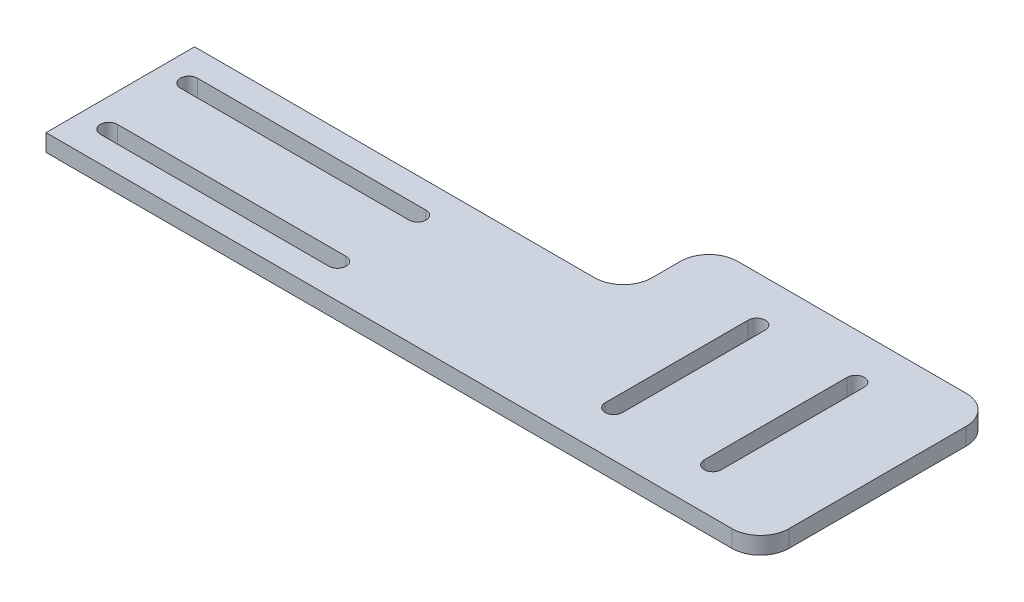
ISO-10303-21;
HEADER;
FILE_DESCRIPTION(('STEP AP214'),'2;1');
FILE_NAME('part.step','',(''),(''),'','','');
FILE_SCHEMA(('AUTOMOTIVE_DESIGN { 1 0 10303 214 1 1 1 1 }'));
ENDSEC;
DATA;
#1=APPLICATION_CONTEXT('core data for automotive mechanical design processes');
#2=APPLICATION_PROTOCOL_DEFINITION('international standard','automotive_design',2000,#1);
#3=PRODUCT_CONTEXT('',#1,'mechanical');
#4=PRODUCT('Part','Part','',(#3));
#5=PRODUCT_RELATED_PRODUCT_CATEGORY('part','',(#4));
#6=PRODUCT_DEFINITION_FORMATION('','',#4);
#7=PRODUCT_DEFINITION_CONTEXT('part definition',#1,'design');
#8=PRODUCT_DEFINITION('design','',#6,#7);
#9=PRODUCT_DEFINITION_SHAPE('','',#8);
#10=(LENGTH_UNIT() NAMED_UNIT(*) SI_UNIT(.MILLI.,.METRE.));
#11=(NAMED_UNIT(*) PLANE_ANGLE_UNIT() SI_UNIT($,.RADIAN.));
#12=(NAMED_UNIT(*) SI_UNIT($,.STERADIAN.) SOLID_ANGLE_UNIT());
#13=UNCERTAINTY_MEASURE_WITH_UNIT(LENGTH_MEASURE(1.E-05),#10,'distance_accuracy_value','');
#14=(GEOMETRIC_REPRESENTATION_CONTEXT(3) GLOBAL_UNCERTAINTY_ASSIGNED_CONTEXT((#13)) GLOBAL_UNIT_ASSIGNED_CONTEXT((#10,
#11,#12)) REPRESENTATION_CONTEXT('',''));
#15=CARTESIAN_POINT('',(0.,0.,0.));
#16=DIRECTION('',(0.,0.,1.));
#17=DIRECTION('',(1.,0.,0.));
#18=AXIS2_PLACEMENT_3D('',#15,#16,#17);
#19=CARTESIAN_POINT('',(0.,3.,26.));
#20=DIRECTION('',(1.,0.,0.));
#21=DIRECTION('',(0.,0.,-1.));
#22=AXIS2_PLACEMENT_3D('',#19,#20,#21);
#23=PLANE('',#22);
#24=DIRECTION('',(0.,0.,1.));
#25=VECTOR('',#24,1.);
#26=CARTESIAN_POINT('',(0.,0.,26.));
#27=LINE('',#26,#25);
#28=CARTESIAN_POINT('',(0.,0.,0.));
#29=VERTEX_POINT('',#28);
#30=CARTESIAN_POINT('',(0.,0.,26.));
#31=VERTEX_POINT('',#30);
#32=EDGE_CURVE('E305',#29,#31,#27,.T.);
#33=ORIENTED_EDGE('',*,*,#32,.T.);
#34=DIRECTION('',(0.,-1.,0.));
#35=VECTOR('',#34,1.);
#36=CARTESIAN_POINT('',(0.,3.,26.));
#37=LINE('',#36,#35);
#38=CARTESIAN_POINT('',(0.,3.,26.));
#39=VERTEX_POINT('',#38);
#40=EDGE_CURVE('E378',#39,#31,#37,.T.);
#41=ORIENTED_EDGE('',*,*,#40,.F.);
#42=DIRECTION('',(0.,0.,1.));
#43=VECTOR('',#42,1.);
#44=CARTESIAN_POINT('',(0.,3.,26.));
#45=LINE('',#44,#43);
#46=CARTESIAN_POINT('',(0.,3.,0.));
#47=VERTEX_POINT('',#46);
#48=EDGE_CURVE('E342',#47,#39,#45,.T.);
#49=ORIENTED_EDGE('',*,*,#48,.F.);
#50=DIRECTION('',(0.,-1.,0.));
#51=VECTOR('',#50,1.);
#52=CARTESIAN_POINT('',(0.,3.,0.));
#53=LINE('',#52,#51);
#54=EDGE_CURVE('E360',#47,#29,#53,.T.);
#55=ORIENTED_EDGE('',*,*,#54,.T.);
#56=EDGE_LOOP('',(#33,#41,#49,#55));
#57=FACE_BOUND('',#56,.T.);
#58=ADVANCED_FACE('F36',(#57),#23,.F.);
#59=CARTESIAN_POINT('',(125.,3.,26.));
#60=DIRECTION('',(0.,0.,-1.));
#61=DIRECTION('',(-1.,0.,0.));
#62=AXIS2_PLACEMENT_3D('',#59,#60,#61);
#63=PLANE('',#62);
#64=DIRECTION('',(1.,0.,0.));
#65=VECTOR('',#64,1.);
#66=CARTESIAN_POINT('',(125.,0.,26.));
#67=LINE('',#66,#65);
#68=CARTESIAN_POINT('',(120.,0.,26.));
#69=VERTEX_POINT('',#68);
#70=EDGE_CURVE('E363',#31,#69,#67,.T.);
#71=ORIENTED_EDGE('',*,*,#70,.T.);
#72=DIRECTION('',(0.,-1.,0.));
#73=VECTOR('',#72,1.);
#74=CARTESIAN_POINT('',(120.,3.,26.));
#75=LINE('',#74,#73);
#76=CARTESIAN_POINT('',(120.,3.,26.));
#77=VERTEX_POINT('',#76);
#78=EDGE_CURVE('E411',#69,#77,#75,.F.);
#79=ORIENTED_EDGE('',*,*,#78,.T.);
#80=DIRECTION('',(1.,0.,0.));
#81=VECTOR('',#80,1.);
#82=CARTESIAN_POINT('',(125.,3.,26.));
#83=LINE('',#82,#81);
#84=EDGE_CURVE('E345',#39,#77,#83,.T.);
#85=ORIENTED_EDGE('',*,*,#84,.F.);
#86=ORIENTED_EDGE('',*,*,#40,.T.);
#87=EDGE_LOOP('',(#71,#79,#85,#86));
#88=FACE_BOUND('',#87,.T.);
#89=ADVANCED_FACE('F465',(#88),#63,.F.);
#90=CARTESIAN_POINT('',(125.,3.,-15.));
#91=DIRECTION('',(-1.,0.,0.));
#92=DIRECTION('',(0.,0.,1.));
#93=AXIS2_PLACEMENT_3D('',#90,#91,#92);
#94=PLANE('',#93);
#95=DIRECTION('',(0.,0.,-1.));
#96=VECTOR('',#95,1.);
#97=CARTESIAN_POINT('',(125.,3.,-15.));
#98=LINE('',#97,#96);
#99=CARTESIAN_POINT('',(125.,3.,21.));
#100=VERTEX_POINT('',#99);
#101=CARTESIAN_POINT('',(125.,3.,-9.99999999999999));
#102=VERTEX_POINT('',#101);
#103=EDGE_CURVE('E349',#100,#102,#98,.T.);
#104=ORIENTED_EDGE('',*,*,#103,.F.);
#105=DIRECTION('',(0.,-1.,0.));
#106=VECTOR('',#105,1.);
#107=CARTESIAN_POINT('',(125.,3.,21.));
#108=LINE('',#107,#106);
#109=CARTESIAN_POINT('',(125.,0.,21.));
#110=VERTEX_POINT('',#109);
#111=EDGE_CURVE('E408',#100,#110,#108,.T.);
#112=ORIENTED_EDGE('',*,*,#111,.T.);
#113=DIRECTION('',(0.,0.,-1.));
#114=VECTOR('',#113,1.);
#115=CARTESIAN_POINT('',(125.,0.,-15.));
#116=LINE('',#115,#114);
#117=CARTESIAN_POINT('',(125.,0.,-9.99999999999999));
#118=VERTEX_POINT('',#117);
#119=EDGE_CURVE('E366',#110,#118,#116,.T.);
#120=ORIENTED_EDGE('',*,*,#119,.T.);
#121=DIRECTION('',(0.,-1.,0.));
#122=VECTOR('',#121,1.);
#123=CARTESIAN_POINT('',(125.,3.,-9.99999999999999));
#124=LINE('',#123,#122);
#125=EDGE_CURVE('E406',#118,#102,#124,.F.);
#126=ORIENTED_EDGE('',*,*,#125,.T.);
#127=EDGE_LOOP('',(#104,#112,#120,#126));
#128=FACE_BOUND('',#127,.T.);
#129=ADVANCED_FACE('F443',(#128),#94,.F.);
#130=CARTESIAN_POINT('',(75.,3.,-15.));
#131=DIRECTION('',(0.,0.,1.));
#132=DIRECTION('',(1.,0.,0.));
#133=AXIS2_PLACEMENT_3D('',#130,#131,#132);
#134=PLANE('',#133);
#135=DIRECTION('',(-1.,0.,0.));
#136=VECTOR('',#135,1.);
#137=CARTESIAN_POINT('',(75.,0.,-15.));
#138=LINE('',#137,#136);
#139=CARTESIAN_POINT('',(120.,0.,-15.));
#140=VERTEX_POINT('',#139);
#141=CARTESIAN_POINT('',(80.,0.,-15.));
#142=VERTEX_POINT('',#141);
#143=EDGE_CURVE('E369',#140,#142,#138,.T.);
#144=ORIENTED_EDGE('',*,*,#143,.T.);
#145=DIRECTION('',(0.,-1.,0.));
#146=VECTOR('',#145,1.);
#147=CARTESIAN_POINT('',(80.,3.,-15.));
#148=LINE('',#147,#146);
#149=CARTESIAN_POINT('',(80.,3.,-15.));
#150=VERTEX_POINT('',#149);
#151=EDGE_CURVE('E398',#142,#150,#148,.F.);
#152=ORIENTED_EDGE('',*,*,#151,.T.);
#153=DIRECTION('',(-1.,0.,0.));
#154=VECTOR('',#153,1.);
#155=CARTESIAN_POINT('',(75.,3.,-15.));
#156=LINE('',#155,#154);
#157=CARTESIAN_POINT('',(120.,3.,-15.));
#158=VERTEX_POINT('',#157);
#159=EDGE_CURVE('E352',#158,#150,#156,.T.);
#160=ORIENTED_EDGE('',*,*,#159,.F.);
#161=DIRECTION('',(0.,-1.,0.));
#162=VECTOR('',#161,1.);
#163=CARTESIAN_POINT('',(120.,3.,-15.));
#164=LINE('',#163,#162);
#165=EDGE_CURVE('E395',#158,#140,#164,.T.);
#166=ORIENTED_EDGE('',*,*,#165,.T.);
#167=EDGE_LOOP('',(#144,#152,#160,#166));
#168=FACE_BOUND('',#167,.T.);
#169=ADVANCED_FACE('F451',(#168),#134,.F.);
#170=CARTESIAN_POINT('',(75.,3.,0.));
#171=DIRECTION('',(1.,0.,0.));
#172=DIRECTION('',(0.,0.,-1.));
#173=AXIS2_PLACEMENT_3D('',#170,#171,#172);
#174=PLANE('',#173);
#175=DIRECTION('',(0.,0.,1.));
#176=VECTOR('',#175,1.);
#177=CARTESIAN_POINT('',(75.,0.,0.));
#178=LINE('',#177,#176);
#179=CARTESIAN_POINT('',(75.,0.,-9.99999999999999));
#180=VERTEX_POINT('',#179);
#181=CARTESIAN_POINT('',(75.,0.,-5.));
#182=VERTEX_POINT('',#181);
#183=EDGE_CURVE('E372',#180,#182,#178,.T.);
#184=ORIENTED_EDGE('',*,*,#183,.T.);
#185=DIRECTION('',(0.,-1.,0.));
#186=VECTOR('',#185,1.);
#187=CARTESIAN_POINT('',(75.,3.,-5.));
#188=LINE('',#187,#186);
#189=CARTESIAN_POINT('',(75.,3.,-5.));
#190=VERTEX_POINT('',#189);
#191=EDGE_CURVE('E387',#182,#190,#188,.F.);
#192=ORIENTED_EDGE('',*,*,#191,.T.);
#193=DIRECTION('',(0.,0.,1.));
#194=VECTOR('',#193,1.);
#195=CARTESIAN_POINT('',(75.,3.,0.));
#196=LINE('',#195,#194);
#197=CARTESIAN_POINT('',(75.,3.,-9.99999999999999));
#198=VERTEX_POINT('',#197);
#199=EDGE_CURVE('E355',#198,#190,#196,.T.);
#200=ORIENTED_EDGE('',*,*,#199,.F.);
#201=DIRECTION('',(0.,-1.,0.));
#202=VECTOR('',#201,1.);
#203=CARTESIAN_POINT('',(75.,3.,-9.99999999999999));
#204=LINE('',#203,#202);
#205=EDGE_CURVE('E384',#198,#180,#204,.T.);
#206=ORIENTED_EDGE('',*,*,#205,.T.);
#207=EDGE_LOOP('',(#184,#192,#200,#206));
#208=FACE_BOUND('',#207,.T.);
#209=ADVANCED_FACE('F420',(#208),#174,.F.);
#210=CARTESIAN_POINT('',(0.,3.,0.));
#211=DIRECTION('',(0.,0.,1.));
#212=DIRECTION('',(1.,0.,0.));
#213=AXIS2_PLACEMENT_3D('',#210,#211,#212);
#214=PLANE('',#213);
#215=DIRECTION('',(-1.,0.,0.));
#216=VECTOR('',#215,1.);
#217=CARTESIAN_POINT('',(0.,3.,0.));
#218=LINE('',#217,#216);
#219=CARTESIAN_POINT('',(70.,3.,0.));
#220=VERTEX_POINT('',#219);
#221=EDGE_CURVE('E358',#220,#47,#218,.T.);
#222=ORIENTED_EDGE('',*,*,#221,.F.);
#223=DIRECTION('',(0.,-1.,0.));
#224=VECTOR('',#223,1.);
#225=CARTESIAN_POINT('',(70.,0.,0.));
#226=LINE('',#225,#224);
#227=CARTESIAN_POINT('',(70.,0.,0.));
#228=VERTEX_POINT('',#227);
#229=EDGE_CURVE('E381',#220,#228,#226,.T.);
#230=ORIENTED_EDGE('',*,*,#229,.T.);
#231=DIRECTION('',(-1.,0.,0.));
#232=VECTOR('',#231,1.);
#233=CARTESIAN_POINT('',(0.,0.,0.));
#234=LINE('',#233,#232);
#235=EDGE_CURVE('E346',#228,#29,#234,.T.);
#236=ORIENTED_EDGE('',*,*,#235,.T.);
#237=ORIENTED_EDGE('',*,*,#54,.F.);
#238=EDGE_LOOP('',(#222,#230,#236,#237));
#239=FACE_BOUND('',#238,.T.);
#240=ADVANCED_FACE('F430',(#239),#214,.F.);
#241=CARTESIAN_POINT('',(0.,3.,0.));
#242=DIRECTION('',(0.,-1.,0.));
#243=DIRECTION('',(0.,0.,-1.));
#244=AXIS2_PLACEMENT_3D('',#241,#242,#243);
#245=PLANE('',#244);
#246=DIRECTION('',(-1.,0.,0.));
#247=VECTOR('',#246,1.);
#248=CARTESIAN_POINT('',(45.,3.,18.5));
#249=LINE('',#248,#247);
#250=CARTESIAN_POINT('',(45.,3.,18.5));
#251=VERTEX_POINT('',#250);
#252=CARTESIAN_POINT('',(5.,3.,18.5));
#253=VERTEX_POINT('',#252);
#254=EDGE_CURVE('E238',#251,#253,#249,.T.);
#255=ORIENTED_EDGE('',*,*,#254,.F.);
#256=CARTESIAN_POINT('',(45.,3.,20.));
#257=DIRECTION('',(0.,1.,0.));
#258=DIRECTION('',(0.,0.,1.));
#259=AXIS2_PLACEMENT_3D('',#256,#257,#258);
#260=CIRCLE('',#259,1.5);
#261=CARTESIAN_POINT('',(45.,3.,21.5));
#262=VERTEX_POINT('',#261);
#263=EDGE_CURVE('E51',#262,#251,#260,.T.);
#264=ORIENTED_EDGE('',*,*,#263,.F.);
#265=DIRECTION('',(1.,0.,0.));
#266=VECTOR('',#265,1.);
#267=CARTESIAN_POINT('',(45.,3.,21.5));
#268=LINE('',#267,#266);
#269=CARTESIAN_POINT('',(5.,3.,21.5));
#270=VERTEX_POINT('',#269);
#271=EDGE_CURVE('E229',#270,#262,#268,.T.);
#272=ORIENTED_EDGE('',*,*,#271,.F.);
#273=CARTESIAN_POINT('',(5.,3.,20.));
#274=DIRECTION('',(0.,1.,0.));
#275=DIRECTION('',(0.,0.,1.));
#276=AXIS2_PLACEMENT_3D('',#273,#274,#275);
#277=CIRCLE('',#276,1.5);
#278=EDGE_CURVE('E232',#253,#270,#277,.T.);
#279=ORIENTED_EDGE('',*,*,#278,.F.);
#280=EDGE_LOOP('',(#255,#264,#272,#279));
#281=FACE_BOUND('',#280,.T.);
#282=DIRECTION('',(-1.,0.,0.));
#283=VECTOR('',#282,1.);
#284=CARTESIAN_POINT('',(45.,3.,4.50000000000002));
#285=LINE('',#284,#283);
#286=CARTESIAN_POINT('',(45.,3.,4.50000000000002));
#287=VERTEX_POINT('',#286);
#288=CARTESIAN_POINT('',(5.,3.,4.50000000000003));
#289=VERTEX_POINT('',#288);
#290=EDGE_CURVE('E264',#287,#289,#285,.T.);
#291=ORIENTED_EDGE('',*,*,#290,.F.);
#292=CARTESIAN_POINT('',(45.,3.,6.00000000000003));
#293=DIRECTION('',(0.,1.,0.));
#294=DIRECTION('',(0.,0.,-1.));
#295=AXIS2_PLACEMENT_3D('',#292,#293,#294);
#296=CIRCLE('',#295,1.49999999999999);
#297=CARTESIAN_POINT('',(45.,3.,7.49999999999999));
#298=VERTEX_POINT('',#297);
#299=EDGE_CURVE('E59',#298,#287,#296,.T.);
#300=ORIENTED_EDGE('',*,*,#299,.F.);
#301=DIRECTION('',(1.,0.,0.));
#302=VECTOR('',#301,1.);
#303=CARTESIAN_POINT('',(45.,3.,7.49999999999999));
#304=LINE('',#303,#302);
#305=CARTESIAN_POINT('',(5.,3.,7.50000000000002));
#306=VERTEX_POINT('',#305);
#307=EDGE_CURVE('E253',#306,#298,#304,.T.);
#308=ORIENTED_EDGE('',*,*,#307,.F.);
#309=CARTESIAN_POINT('',(5.,3.,6.00000000000003));
#310=DIRECTION('',(0.,1.,0.));
#311=DIRECTION('',(0.,0.,-1.));
#312=AXIS2_PLACEMENT_3D('',#309,#310,#311);
#313=CIRCLE('',#312,1.49999999999999);
#314=EDGE_CURVE('E267',#289,#306,#313,.T.);
#315=ORIENTED_EDGE('',*,*,#314,.F.);
#316=EDGE_LOOP('',(#291,#300,#308,#315));
#317=FACE_BOUND('',#316,.T.);
#318=DIRECTION('',(0.,0.,1.));
#319=VECTOR('',#318,1.);
#320=CARTESIAN_POINT('',(89.84,3.,-6.99999999999996));
#321=LINE('',#320,#319);
#322=CARTESIAN_POINT('',(89.84,3.,-6.99999999999996));
#323=VERTEX_POINT('',#322);
#324=CARTESIAN_POINT('',(89.84,3.,18.));
#325=VERTEX_POINT('',#324);
#326=EDGE_CURVE('E294',#323,#325,#321,.T.);
#327=ORIENTED_EDGE('',*,*,#326,.F.);
#328=CARTESIAN_POINT('',(91.34,3.,-6.99999999999996));
#329=DIRECTION('',(0.,1.,0.));
#330=DIRECTION('',(0.,0.,1.));
#331=AXIS2_PLACEMENT_3D('',#328,#329,#330);
#332=CIRCLE('',#331,1.50000000000001);
#333=CARTESIAN_POINT('',(92.84,3.,-6.99999999999996));
#334=VERTEX_POINT('',#333);
#335=EDGE_CURVE('E292',#334,#323,#332,.T.);
#336=ORIENTED_EDGE('',*,*,#335,.F.);
#337=DIRECTION('',(0.,0.,-1.));
#338=VECTOR('',#337,1.);
#339=CARTESIAN_POINT('',(92.84,3.,-6.99999999999996));
#340=LINE('',#339,#338);
#341=CARTESIAN_POINT('',(92.84,3.,18.));
#342=VERTEX_POINT('',#341);
#343=EDGE_CURVE('E282',#342,#334,#340,.T.);
#344=ORIENTED_EDGE('',*,*,#343,.F.);
#345=CARTESIAN_POINT('',(91.34,3.,18.));
#346=DIRECTION('',(0.,1.,0.));
#347=DIRECTION('',(0.,0.,1.));
#348=AXIS2_PLACEMENT_3D('',#345,#346,#347);
#349=CIRCLE('',#348,1.50000000000001);
#350=EDGE_CURVE('E298',#325,#342,#349,.T.);
#351=ORIENTED_EDGE('',*,*,#350,.F.);
#352=EDGE_LOOP('',(#327,#336,#344,#351));
#353=FACE_BOUND('',#352,.T.);
#354=DIRECTION('',(0.,0.,1.));
#355=VECTOR('',#354,1.);
#356=CARTESIAN_POINT('',(107.16,3.,-6.99999999999996));
#357=LINE('',#356,#355);
#358=CARTESIAN_POINT('',(107.16,3.,-6.99999999999996));
#359=VERTEX_POINT('',#358);
#360=CARTESIAN_POINT('',(107.16,3.,18.));
#361=VERTEX_POINT('',#360);
#362=EDGE_CURVE('E327',#359,#361,#357,.T.);
#363=ORIENTED_EDGE('',*,*,#362,.F.);
#364=CARTESIAN_POINT('',(108.66,3.,-6.99999999999996));
#365=DIRECTION('',(0.,1.,0.));
#366=DIRECTION('',(0.,0.,-1.));
#367=AXIS2_PLACEMENT_3D('',#364,#365,#366);
#368=CIRCLE('',#367,1.49999999999999);
#369=CARTESIAN_POINT('',(110.16,3.,-6.99999999999996));
#370=VERTEX_POINT('',#369);
#371=EDGE_CURVE('E245',#370,#359,#368,.T.);
#372=ORIENTED_EDGE('',*,*,#371,.F.);
#373=DIRECTION('',(0.,0.,-1.));
#374=VECTOR('',#373,1.);
#375=CARTESIAN_POINT('',(110.16,3.,-6.99999999999996));
#376=LINE('',#375,#374);
#377=CARTESIAN_POINT('',(110.16,3.,18.));
#378=VERTEX_POINT('',#377);
#379=EDGE_CURVE('E316',#378,#370,#376,.T.);
#380=ORIENTED_EDGE('',*,*,#379,.F.);
#381=CARTESIAN_POINT('',(108.66,3.,18.));
#382=DIRECTION('',(0.,1.,0.));
#383=DIRECTION('',(0.,0.,-1.));
#384=AXIS2_PLACEMENT_3D('',#381,#382,#383);
#385=CIRCLE('',#384,1.49999999999999);
#386=EDGE_CURVE('E330',#361,#378,#385,.T.);
#387=ORIENTED_EDGE('',*,*,#386,.F.);
#388=EDGE_LOOP('',(#363,#372,#380,#387));
#389=FACE_BOUND('',#388,.T.);
#390=ORIENTED_EDGE('',*,*,#159,.T.);
#391=CARTESIAN_POINT('',(80.,3.,-9.99999999999999));
#392=DIRECTION('',(0.,-1.,0.));
#393=DIRECTION('',(0.,0.,-1.));
#394=AXIS2_PLACEMENT_3D('',#391,#392,#393);
#395=CIRCLE('',#394,5.);
#396=EDGE_CURVE('E404',#150,#198,#395,.F.);
#397=ORIENTED_EDGE('',*,*,#396,.T.);
#398=ORIENTED_EDGE('',*,*,#199,.T.);
#399=CARTESIAN_POINT('',(70.,3.,-5.));
#400=DIRECTION('',(0.,-1.,0.));
#401=DIRECTION('',(0.,0.,-1.));
#402=AXIS2_PLACEMENT_3D('',#399,#400,#401);
#403=CIRCLE('',#402,5.);
#404=EDGE_CURVE('E11',#190,#220,#403,.T.);
#405=ORIENTED_EDGE('',*,*,#404,.T.);
#406=ORIENTED_EDGE('',*,*,#221,.T.);
#407=ORIENTED_EDGE('',*,*,#48,.T.);
#408=ORIENTED_EDGE('',*,*,#84,.T.);
#409=CARTESIAN_POINT('',(120.,3.,21.));
#410=DIRECTION('',(0.,-1.,0.));
#411=DIRECTION('',(0.,0.,-1.));
#412=AXIS2_PLACEMENT_3D('',#409,#410,#411);
#413=CIRCLE('',#412,5.);
#414=EDGE_CURVE('E402',#77,#100,#413,.F.);
#415=ORIENTED_EDGE('',*,*,#414,.T.);
#416=ORIENTED_EDGE('',*,*,#103,.T.);
#417=CARTESIAN_POINT('',(120.,3.,-9.99999999999999));
#418=DIRECTION('',(0.,-1.,0.));
#419=DIRECTION('',(0.,0.,-1.));
#420=AXIS2_PLACEMENT_3D('',#417,#418,#419);
#421=CIRCLE('',#420,5.);
#422=EDGE_CURVE('E400',#102,#158,#421,.F.);
#423=ORIENTED_EDGE('',*,*,#422,.T.);
#424=EDGE_LOOP('',(#390,#397,#398,#405,#406,#407,#408,#415,#416,#423));
#425=FACE_BOUND('',#424,.T.);
#426=ADVANCED_FACE('F427',(#281,#317,#353,#389,#425),#245,.F.);
#427=CARTESIAN_POINT('',(0.,0.,0.));
#428=DIRECTION('',(0.,-1.,0.));
#429=DIRECTION('',(0.,0.,-1.));
#430=AXIS2_PLACEMENT_3D('',#427,#428,#429);
#431=PLANE('',#430);
#432=CARTESIAN_POINT('',(45.,0.,20.));
#433=DIRECTION('',(0.,1.,0.));
#434=DIRECTION('',(0.,0.,1.));
#435=AXIS2_PLACEMENT_3D('',#432,#433,#434);
#436=CIRCLE('',#435,1.5);
#437=CARTESIAN_POINT('',(45.,0.,21.5));
#438=VERTEX_POINT('',#437);
#439=CARTESIAN_POINT('',(45.,0.,18.5));
#440=VERTEX_POINT('',#439);
#441=EDGE_CURVE('E210',#438,#440,#436,.T.);
#442=ORIENTED_EDGE('',*,*,#441,.T.);
#443=DIRECTION('',(-1.,0.,0.));
#444=VECTOR('',#443,1.);
#445=CARTESIAN_POINT('',(45.,0.,18.5));
#446=LINE('',#445,#444);
#447=CARTESIAN_POINT('',(5.,0.,18.5));
#448=VERTEX_POINT('',#447);
#449=EDGE_CURVE('E220',#440,#448,#446,.T.);
#450=ORIENTED_EDGE('',*,*,#449,.T.);
#451=CARTESIAN_POINT('',(5.,0.,20.));
#452=DIRECTION('',(0.,1.,0.));
#453=DIRECTION('',(0.,0.,1.));
#454=AXIS2_PLACEMENT_3D('',#451,#452,#453);
#455=CIRCLE('',#454,1.5);
#456=CARTESIAN_POINT('',(5.,0.,21.5));
#457=VERTEX_POINT('',#456);
#458=EDGE_CURVE('E224',#448,#457,#455,.T.);
#459=ORIENTED_EDGE('',*,*,#458,.T.);
#460=DIRECTION('',(1.,0.,0.));
#461=VECTOR('',#460,1.);
#462=CARTESIAN_POINT('',(45.,0.,21.5));
#463=LINE('',#462,#461);
#464=EDGE_CURVE('E216',#457,#438,#463,.T.);
#465=ORIENTED_EDGE('',*,*,#464,.T.);
#466=EDGE_LOOP('',(#442,#450,#459,#465));
#467=FACE_BOUND('',#466,.T.);
#468=CARTESIAN_POINT('',(45.,0.,6.00000000000003));
#469=DIRECTION('',(0.,1.,0.));
#470=DIRECTION('',(0.,0.,-1.));
#471=AXIS2_PLACEMENT_3D('',#468,#469,#470);
#472=CIRCLE('',#471,1.49999999999999);
#473=CARTESIAN_POINT('',(45.,0.,7.49999999999999));
#474=VERTEX_POINT('',#473);
#475=CARTESIAN_POINT('',(45.,0.,4.50000000000002));
#476=VERTEX_POINT('',#475);
#477=EDGE_CURVE('E249',#474,#476,#472,.T.);
#478=ORIENTED_EDGE('',*,*,#477,.T.);
#479=DIRECTION('',(-1.,0.,0.));
#480=VECTOR('',#479,1.);
#481=CARTESIAN_POINT('',(45.,0.,4.50000000000002));
#482=LINE('',#481,#480);
#483=CARTESIAN_POINT('',(5.,0.,4.50000000000003));
#484=VERTEX_POINT('',#483);
#485=EDGE_CURVE('E252',#476,#484,#482,.T.);
#486=ORIENTED_EDGE('',*,*,#485,.T.);
#487=CARTESIAN_POINT('',(5.,0.,6.00000000000003));
#488=DIRECTION('',(0.,1.,0.));
#489=DIRECTION('',(0.,0.,-1.));
#490=AXIS2_PLACEMENT_3D('',#487,#488,#489);
#491=CIRCLE('',#490,1.49999999999999);
#492=CARTESIAN_POINT('',(5.,0.,7.50000000000002));
#493=VERTEX_POINT('',#492);
#494=EDGE_CURVE('E256',#484,#493,#491,.T.);
#495=ORIENTED_EDGE('',*,*,#494,.T.);
#496=DIRECTION('',(1.,0.,0.));
#497=VECTOR('',#496,1.);
#498=CARTESIAN_POINT('',(45.,0.,7.49999999999999));
#499=LINE('',#498,#497);
#500=EDGE_CURVE('E259',#493,#474,#499,.T.);
#501=ORIENTED_EDGE('',*,*,#500,.T.);
#502=EDGE_LOOP('',(#478,#486,#495,#501));
#503=FACE_BOUND('',#502,.T.);
#504=CARTESIAN_POINT('',(91.34,0.,-6.99999999999996));
#505=DIRECTION('',(0.,1.,0.));
#506=DIRECTION('',(0.,0.,1.));
#507=AXIS2_PLACEMENT_3D('',#504,#505,#506);
#508=CIRCLE('',#507,1.50000000000001);
#509=CARTESIAN_POINT('',(92.84,0.,-6.99999999999996));
#510=VERTEX_POINT('',#509);
#511=CARTESIAN_POINT('',(89.84,0.,-6.99999999999996));
#512=VERTEX_POINT('',#511);
#513=EDGE_CURVE('E278',#510,#512,#508,.T.);
#514=ORIENTED_EDGE('',*,*,#513,.T.);
#515=DIRECTION('',(0.,0.,1.));
#516=VECTOR('',#515,1.);
#517=CARTESIAN_POINT('',(89.84,0.,-6.99999999999996));
#518=LINE('',#517,#516);
#519=CARTESIAN_POINT('',(89.84,0.,18.));
#520=VERTEX_POINT('',#519);
#521=EDGE_CURVE('E281',#512,#520,#518,.T.);
#522=ORIENTED_EDGE('',*,*,#521,.T.);
#523=CARTESIAN_POINT('',(91.34,0.,18.));
#524=DIRECTION('',(0.,1.,0.));
#525=DIRECTION('',(0.,0.,1.));
#526=AXIS2_PLACEMENT_3D('',#523,#524,#525);
#527=CIRCLE('',#526,1.50000000000001);
#528=CARTESIAN_POINT('',(92.84,0.,18.));
#529=VERTEX_POINT('',#528);
#530=EDGE_CURVE('E285',#520,#529,#527,.T.);
#531=ORIENTED_EDGE('',*,*,#530,.T.);
#532=DIRECTION('',(0.,0.,-1.));
#533=VECTOR('',#532,1.);
#534=CARTESIAN_POINT('',(92.84,0.,-6.99999999999996));
#535=LINE('',#534,#533);
#536=EDGE_CURVE('E288',#529,#510,#535,.T.);
#537=ORIENTED_EDGE('',*,*,#536,.T.);
#538=EDGE_LOOP('',(#514,#522,#531,#537));
#539=FACE_BOUND('',#538,.T.);
#540=CARTESIAN_POINT('',(108.66,0.,-6.99999999999996));
#541=DIRECTION('',(0.,1.,0.));
#542=DIRECTION('',(0.,0.,-1.));
#543=AXIS2_PLACEMENT_3D('',#540,#541,#542);
#544=CIRCLE('',#543,1.49999999999999);
#545=CARTESIAN_POINT('',(110.16,0.,-6.99999999999996));
#546=VERTEX_POINT('',#545);
#547=CARTESIAN_POINT('',(107.16,0.,-6.99999999999996));
#548=VERTEX_POINT('',#547);
#549=EDGE_CURVE('E312',#546,#548,#544,.T.);
#550=ORIENTED_EDGE('',*,*,#549,.T.);
#551=DIRECTION('',(0.,0.,1.));
#552=VECTOR('',#551,1.);
#553=CARTESIAN_POINT('',(107.16,0.,-6.99999999999996));
#554=LINE('',#553,#552);
#555=CARTESIAN_POINT('',(107.16,0.,18.));
#556=VERTEX_POINT('',#555);
#557=EDGE_CURVE('E315',#548,#556,#554,.T.);
#558=ORIENTED_EDGE('',*,*,#557,.T.);
#559=CARTESIAN_POINT('',(108.66,0.,18.));
#560=DIRECTION('',(0.,1.,0.));
#561=DIRECTION('',(0.,0.,-1.));
#562=AXIS2_PLACEMENT_3D('',#559,#560,#561);
#563=CIRCLE('',#562,1.49999999999999);
#564=CARTESIAN_POINT('',(110.16,0.,18.));
#565=VERTEX_POINT('',#564);
#566=EDGE_CURVE('E319',#556,#565,#563,.T.);
#567=ORIENTED_EDGE('',*,*,#566,.T.);
#568=DIRECTION('',(0.,0.,-1.));
#569=VECTOR('',#568,1.);
#570=CARTESIAN_POINT('',(110.16,0.,-6.99999999999996));
#571=LINE('',#570,#569);
#572=EDGE_CURVE('E322',#565,#546,#571,.T.);
#573=ORIENTED_EDGE('',*,*,#572,.T.);
#574=EDGE_LOOP('',(#550,#558,#567,#573));
#575=FACE_BOUND('',#574,.T.);
#576=ORIENTED_EDGE('',*,*,#183,.F.);
#577=CARTESIAN_POINT('',(80.,0.,-9.99999999999999));
#578=DIRECTION('',(0.,-1.,0.));
#579=DIRECTION('',(0.,0.,-1.));
#580=AXIS2_PLACEMENT_3D('',#577,#578,#579);
#581=CIRCLE('',#580,5.);
#582=EDGE_CURVE('E393',#180,#142,#581,.T.);
#583=ORIENTED_EDGE('',*,*,#582,.T.);
#584=ORIENTED_EDGE('',*,*,#143,.F.);
#585=CARTESIAN_POINT('',(120.,0.,-9.99999999999999));
#586=DIRECTION('',(0.,-1.,0.));
#587=DIRECTION('',(0.,0.,-1.));
#588=AXIS2_PLACEMENT_3D('',#585,#586,#587);
#589=CIRCLE('',#588,5.);
#590=EDGE_CURVE('E389',#140,#118,#589,.T.);
#591=ORIENTED_EDGE('',*,*,#590,.T.);
#592=ORIENTED_EDGE('',*,*,#119,.F.);
#593=CARTESIAN_POINT('',(120.,0.,21.));
#594=DIRECTION('',(0.,-1.,0.));
#595=DIRECTION('',(0.,0.,-1.));
#596=AXIS2_PLACEMENT_3D('',#593,#594,#595);
#597=CIRCLE('',#596,5.);
#598=EDGE_CURVE('E391',#110,#69,#597,.T.);
#599=ORIENTED_EDGE('',*,*,#598,.T.);
#600=ORIENTED_EDGE('',*,*,#70,.F.);
#601=ORIENTED_EDGE('',*,*,#32,.F.);
#602=ORIENTED_EDGE('',*,*,#235,.F.);
#603=CARTESIAN_POINT('',(70.,0.,-5.));
#604=DIRECTION('',(0.,-1.,0.));
#605=DIRECTION('',(0.,0.,-1.));
#606=AXIS2_PLACEMENT_3D('',#603,#604,#605);
#607=CIRCLE('',#606,5.);
#608=EDGE_CURVE('E44',#228,#182,#607,.F.);
#609=ORIENTED_EDGE('',*,*,#608,.T.);
#610=EDGE_LOOP('',(#576,#583,#584,#591,#592,#599,#600,#601,#602,#609));
#611=FACE_BOUND('',#610,.T.);
#612=ADVANCED_FACE('F226',(#467,#503,#539,#575,#611),#431,.T.);
#613=CARTESIAN_POINT('',(108.66,0.,-6.99999999999996));
#614=DIRECTION('',(0.,1.,0.));
#615=DIRECTION('',(0.,0.,1.));
#616=AXIS2_PLACEMENT_3D('',#613,#614,#615);
#617=CYLINDRICAL_SURFACE('',#616,1.49999999999999);
#618=ORIENTED_EDGE('',*,*,#371,.T.);
#619=DIRECTION('',(0.,1.,0.));
#620=VECTOR('',#619,1.);
#621=CARTESIAN_POINT('',(107.16,0.,-6.99999999999996));
#622=LINE('',#621,#620);
#623=EDGE_CURVE('E325',#548,#359,#622,.T.);
#624=ORIENTED_EDGE('',*,*,#623,.F.);
#625=ORIENTED_EDGE('',*,*,#549,.F.);
#626=DIRECTION('',(0.,1.,0.));
#627=VECTOR('',#626,1.);
#628=CARTESIAN_POINT('',(110.16,0.,-6.99999999999996));
#629=LINE('',#628,#627);
#630=EDGE_CURVE('E295',#546,#370,#629,.T.);
#631=ORIENTED_EDGE('',*,*,#630,.T.);
#632=EDGE_LOOP('',(#618,#624,#625,#631));
#633=FACE_BOUND('',#632,.T.);
#634=ADVANCED_FACE('F482',(#633),#617,.F.);
#635=CARTESIAN_POINT('',(110.16,0.,-6.99999999999996));
#636=DIRECTION('',(1.,0.,0.));
#637=DIRECTION('',(0.,0.,-1.));
#638=AXIS2_PLACEMENT_3D('',#635,#636,#637);
#639=PLANE('',#638);
#640=ORIENTED_EDGE('',*,*,#379,.T.);
#641=ORIENTED_EDGE('',*,*,#630,.F.);
#642=ORIENTED_EDGE('',*,*,#572,.F.);
#643=DIRECTION('',(0.,1.,0.));
#644=VECTOR('',#643,1.);
#645=CARTESIAN_POINT('',(110.16,0.,18.));
#646=LINE('',#645,#644);
#647=EDGE_CURVE('E336',#565,#378,#646,.T.);
#648=ORIENTED_EDGE('',*,*,#647,.T.);
#649=EDGE_LOOP('',(#640,#641,#642,#648));
#650=FACE_BOUND('',#649,.T.);
#651=ADVANCED_FACE('F488',(#650),#639,.F.);
#652=CARTESIAN_POINT('',(108.66,0.,18.));
#653=DIRECTION('',(0.,1.,0.));
#654=DIRECTION('',(0.,0.,1.));
#655=AXIS2_PLACEMENT_3D('',#652,#653,#654);
#656=CYLINDRICAL_SURFACE('',#655,1.49999999999999);
#657=ORIENTED_EDGE('',*,*,#386,.T.);
#658=ORIENTED_EDGE('',*,*,#647,.F.);
#659=ORIENTED_EDGE('',*,*,#566,.F.);
#660=DIRECTION('',(0.,1.,0.));
#661=VECTOR('',#660,1.);
#662=CARTESIAN_POINT('',(107.16,0.,18.));
#663=LINE('',#662,#661);
#664=EDGE_CURVE('E338',#556,#361,#663,.T.);
#665=ORIENTED_EDGE('',*,*,#664,.T.);
#666=EDGE_LOOP('',(#657,#658,#659,#665));
#667=FACE_BOUND('',#666,.T.);
#668=ADVANCED_FACE('F494',(#667),#656,.F.);
#669=CARTESIAN_POINT('',(107.16,0.,-6.99999999999996));
#670=DIRECTION('',(-1.,0.,0.));
#671=DIRECTION('',(0.,0.,1.));
#672=AXIS2_PLACEMENT_3D('',#669,#670,#671);
#673=PLANE('',#672);
#674=ORIENTED_EDGE('',*,*,#362,.T.);
#675=ORIENTED_EDGE('',*,*,#664,.F.);
#676=ORIENTED_EDGE('',*,*,#557,.F.);
#677=ORIENTED_EDGE('',*,*,#623,.T.);
#678=EDGE_LOOP('',(#674,#675,#676,#677));
#679=FACE_BOUND('',#678,.T.);
#680=ADVANCED_FACE('F490',(#679),#673,.F.);
#681=CARTESIAN_POINT('',(91.34,0.,-6.99999999999996));
#682=DIRECTION('',(0.,1.,0.));
#683=DIRECTION('',(0.,0.,1.));
#684=AXIS2_PLACEMENT_3D('',#681,#682,#683);
#685=CYLINDRICAL_SURFACE('',#684,1.50000000000001);
#686=ORIENTED_EDGE('',*,*,#335,.T.);
#687=DIRECTION('',(0.,1.,0.));
#688=VECTOR('',#687,1.);
#689=CARTESIAN_POINT('',(89.84,0.,-6.99999999999996));
#690=LINE('',#689,#688);
#691=EDGE_CURVE('E291',#512,#323,#690,.T.);
#692=ORIENTED_EDGE('',*,*,#691,.F.);
#693=ORIENTED_EDGE('',*,*,#513,.F.);
#694=DIRECTION('',(0.,1.,0.));
#695=VECTOR('',#694,1.);
#696=CARTESIAN_POINT('',(92.84,0.,-6.99999999999996));
#697=LINE('',#696,#695);
#698=EDGE_CURVE('E303',#510,#334,#697,.T.);
#699=ORIENTED_EDGE('',*,*,#698,.T.);
#700=EDGE_LOOP('',(#686,#692,#693,#699));
#701=FACE_BOUND('',#700,.T.);
#702=ADVANCED_FACE('F493',(#701),#685,.F.);
#703=CARTESIAN_POINT('',(92.84,0.,-6.99999999999996));
#704=DIRECTION('',(1.,0.,0.));
#705=DIRECTION('',(0.,0.,-1.));
#706=AXIS2_PLACEMENT_3D('',#703,#704,#705);
#707=PLANE('',#706);
#708=ORIENTED_EDGE('',*,*,#343,.T.);
#709=ORIENTED_EDGE('',*,*,#698,.F.);
#710=ORIENTED_EDGE('',*,*,#536,.F.);
#711=DIRECTION('',(0.,1.,0.));
#712=VECTOR('',#711,1.);
#713=CARTESIAN_POINT('',(92.84,0.,18.));
#714=LINE('',#713,#712);
#715=EDGE_CURVE('E306',#529,#342,#714,.T.);
#716=ORIENTED_EDGE('',*,*,#715,.T.);
#717=EDGE_LOOP('',(#708,#709,#710,#716));
#718=FACE_BOUND('',#717,.T.);
#719=ADVANCED_FACE('F504',(#718),#707,.F.);
#720=CARTESIAN_POINT('',(91.34,0.,18.));
#721=DIRECTION('',(0.,1.,0.));
#722=DIRECTION('',(0.,0.,1.));
#723=AXIS2_PLACEMENT_3D('',#720,#721,#722);
#724=CYLINDRICAL_SURFACE('',#723,1.50000000000001);
#725=ORIENTED_EDGE('',*,*,#350,.T.);
#726=ORIENTED_EDGE('',*,*,#715,.F.);
#727=ORIENTED_EDGE('',*,*,#530,.F.);
#728=DIRECTION('',(0.,1.,0.));
#729=VECTOR('',#728,1.);
#730=CARTESIAN_POINT('',(89.84,0.,18.));
#731=LINE('',#730,#729);
#732=EDGE_CURVE('E308',#520,#325,#731,.T.);
#733=ORIENTED_EDGE('',*,*,#732,.T.);
#734=EDGE_LOOP('',(#725,#726,#727,#733));
#735=FACE_BOUND('',#734,.T.);
#736=ADVANCED_FACE('F508',(#735),#724,.F.);
#737=CARTESIAN_POINT('',(89.84,0.,-6.99999999999996));
#738=DIRECTION('',(-1.,0.,0.));
#739=DIRECTION('',(0.,0.,1.));
#740=AXIS2_PLACEMENT_3D('',#737,#738,#739);
#741=PLANE('',#740);
#742=ORIENTED_EDGE('',*,*,#326,.T.);
#743=ORIENTED_EDGE('',*,*,#732,.F.);
#744=ORIENTED_EDGE('',*,*,#521,.F.);
#745=ORIENTED_EDGE('',*,*,#691,.T.);
#746=EDGE_LOOP('',(#742,#743,#744,#745));
#747=FACE_BOUND('',#746,.T.);
#748=ADVANCED_FACE('F462',(#747),#741,.F.);
#749=CARTESIAN_POINT('',(70.,3.,-5.));
#750=DIRECTION('',(0.,1.,0.));
#751=DIRECTION('',(0.,0.,1.));
#752=AXIS2_PLACEMENT_3D('',#749,#750,#751);
#753=CYLINDRICAL_SURFACE('',#752,5.);
#754=ORIENTED_EDGE('',*,*,#404,.F.);
#755=ORIENTED_EDGE('',*,*,#191,.F.);
#756=ORIENTED_EDGE('',*,*,#608,.F.);
#757=ORIENTED_EDGE('',*,*,#229,.F.);
#758=EDGE_LOOP('',(#754,#755,#756,#757));
#759=FACE_BOUND('',#758,.T.);
#760=ADVANCED_FACE('F424',(#759),#753,.F.);
#761=CARTESIAN_POINT('',(80.,3.,-9.99999999999999));
#762=DIRECTION('',(0.,-1.,0.));
#763=DIRECTION('',(0.,0.,-1.));
#764=AXIS2_PLACEMENT_3D('',#761,#762,#763);
#765=CYLINDRICAL_SURFACE('',#764,5.);
#766=ORIENTED_EDGE('',*,*,#396,.F.);
#767=ORIENTED_EDGE('',*,*,#151,.F.);
#768=ORIENTED_EDGE('',*,*,#582,.F.);
#769=ORIENTED_EDGE('',*,*,#205,.F.);
#770=EDGE_LOOP('',(#766,#767,#768,#769));
#771=FACE_BOUND('',#770,.T.);
#772=ADVANCED_FACE('F455',(#771),#765,.T.);
#773=CARTESIAN_POINT('',(120.,3.,21.));
#774=DIRECTION('',(0.,-1.,0.));
#775=DIRECTION('',(0.,0.,-1.));
#776=AXIS2_PLACEMENT_3D('',#773,#774,#775);
#777=CYLINDRICAL_SURFACE('',#776,5.);
#778=ORIENTED_EDGE('',*,*,#414,.F.);
#779=ORIENTED_EDGE('',*,*,#78,.F.);
#780=ORIENTED_EDGE('',*,*,#598,.F.);
#781=ORIENTED_EDGE('',*,*,#111,.F.);
#782=EDGE_LOOP('',(#778,#779,#780,#781));
#783=FACE_BOUND('',#782,.T.);
#784=ADVANCED_FACE('F440',(#783),#777,.T.);
#785=CARTESIAN_POINT('',(120.,3.,-9.99999999999999));
#786=DIRECTION('',(0.,-1.,0.));
#787=DIRECTION('',(0.,0.,-1.));
#788=AXIS2_PLACEMENT_3D('',#785,#786,#787);
#789=CYLINDRICAL_SURFACE('',#788,5.);
#790=ORIENTED_EDGE('',*,*,#422,.F.);
#791=ORIENTED_EDGE('',*,*,#125,.F.);
#792=ORIENTED_EDGE('',*,*,#590,.F.);
#793=ORIENTED_EDGE('',*,*,#165,.F.);
#794=EDGE_LOOP('',(#790,#791,#792,#793));
#795=FACE_BOUND('',#794,.T.);
#796=ADVANCED_FACE('F38',(#795),#789,.T.);
#797=CARTESIAN_POINT('',(45.,0.,6.00000000000003));
#798=DIRECTION('',(0.,1.,0.));
#799=DIRECTION('',(0.,0.,1.));
#800=AXIS2_PLACEMENT_3D('',#797,#798,#799);
#801=CYLINDRICAL_SURFACE('',#800,1.49999999999999);
#802=ORIENTED_EDGE('',*,*,#299,.T.);
#803=DIRECTION('',(0.,1.,0.));
#804=VECTOR('',#803,1.);
#805=CARTESIAN_POINT('',(45.,0.,4.50000000000002));
#806=LINE('',#805,#804);
#807=EDGE_CURVE('E262',#476,#287,#806,.T.);
#808=ORIENTED_EDGE('',*,*,#807,.F.);
#809=ORIENTED_EDGE('',*,*,#477,.F.);
#810=DIRECTION('',(0.,1.,0.));
#811=VECTOR('',#810,1.);
#812=CARTESIAN_POINT('',(45.,0.,7.49999999999999));
#813=LINE('',#812,#811);
#814=EDGE_CURVE('E239',#474,#298,#813,.T.);
#815=ORIENTED_EDGE('',*,*,#814,.T.);
#816=EDGE_LOOP('',(#802,#808,#809,#815));
#817=FACE_BOUND('',#816,.T.);
#818=ADVANCED_FACE('F516',(#817),#801,.F.);
#819=CARTESIAN_POINT('',(45.,0.,7.49999999999999));
#820=DIRECTION('',(0.,0.,1.));
#821=DIRECTION('',(1.,0.,0.));
#822=AXIS2_PLACEMENT_3D('',#819,#820,#821);
#823=PLANE('',#822);
#824=ORIENTED_EDGE('',*,*,#307,.T.);
#825=ORIENTED_EDGE('',*,*,#814,.F.);
#826=ORIENTED_EDGE('',*,*,#500,.F.);
#827=DIRECTION('',(0.,1.,0.));
#828=VECTOR('',#827,1.);
#829=CARTESIAN_POINT('',(5.,0.,7.50000000000002));
#830=LINE('',#829,#828);
#831=EDGE_CURVE('E273',#493,#306,#830,.T.);
#832=ORIENTED_EDGE('',*,*,#831,.T.);
#833=EDGE_LOOP('',(#824,#825,#826,#832));
#834=FACE_BOUND('',#833,.T.);
#835=ADVANCED_FACE('F519',(#834),#823,.F.);
#836=CARTESIAN_POINT('',(5.,0.,6.00000000000003));
#837=DIRECTION('',(0.,1.,0.));
#838=DIRECTION('',(0.,0.,1.));
#839=AXIS2_PLACEMENT_3D('',#836,#837,#838);
#840=CYLINDRICAL_SURFACE('',#839,1.49999999999999);
#841=ORIENTED_EDGE('',*,*,#314,.T.);
#842=ORIENTED_EDGE('',*,*,#831,.F.);
#843=ORIENTED_EDGE('',*,*,#494,.F.);
#844=DIRECTION('',(0.,1.,0.));
#845=VECTOR('',#844,1.);
#846=CARTESIAN_POINT('',(5.,0.,4.50000000000003));
#847=LINE('',#846,#845);
#848=EDGE_CURVE('E275',#484,#289,#847,.T.);
#849=ORIENTED_EDGE('',*,*,#848,.T.);
#850=EDGE_LOOP('',(#841,#842,#843,#849));
#851=FACE_BOUND('',#850,.T.);
#852=ADVANCED_FACE('F523',(#851),#840,.F.);
#853=CARTESIAN_POINT('',(45.,0.,4.50000000000002));
#854=DIRECTION('',(0.,0.,-1.));
#855=DIRECTION('',(-1.,0.,0.));
#856=AXIS2_PLACEMENT_3D('',#853,#854,#855);
#857=PLANE('',#856);
#858=ORIENTED_EDGE('',*,*,#290,.T.);
#859=ORIENTED_EDGE('',*,*,#848,.F.);
#860=ORIENTED_EDGE('',*,*,#485,.F.);
#861=ORIENTED_EDGE('',*,*,#807,.T.);
#862=EDGE_LOOP('',(#858,#859,#860,#861));
#863=FACE_BOUND('',#862,.T.);
#864=ADVANCED_FACE('F520',(#863),#857,.F.);
#865=CARTESIAN_POINT('',(45.,0.,20.));
#866=DIRECTION('',(0.,1.,0.));
#867=DIRECTION('',(0.,0.,1.));
#868=AXIS2_PLACEMENT_3D('',#865,#866,#867);
#869=CYLINDRICAL_SURFACE('',#868,1.5);
#870=ORIENTED_EDGE('',*,*,#263,.T.);
#871=DIRECTION('',(0.,1.,0.));
#872=VECTOR('',#871,1.);
#873=CARTESIAN_POINT('',(45.,0.,18.5));
#874=LINE('',#873,#872);
#875=EDGE_CURVE('E206',#440,#251,#874,.T.);
#876=ORIENTED_EDGE('',*,*,#875,.F.);
#877=ORIENTED_EDGE('',*,*,#441,.F.);
#878=DIRECTION('',(0.,1.,0.));
#879=VECTOR('',#878,1.);
#880=CARTESIAN_POINT('',(45.,0.,21.5));
#881=LINE('',#880,#879);
#882=EDGE_CURVE('E243',#438,#262,#881,.T.);
#883=ORIENTED_EDGE('',*,*,#882,.T.);
#884=EDGE_LOOP('',(#870,#876,#877,#883));
#885=FACE_BOUND('',#884,.T.);
#886=ADVANCED_FACE('F208',(#885),#869,.F.);
#887=CARTESIAN_POINT('',(45.,0.,21.5));
#888=DIRECTION('',(0.,0.,1.));
#889=DIRECTION('',(1.,0.,0.));
#890=AXIS2_PLACEMENT_3D('',#887,#888,#889);
#891=PLANE('',#890);
#892=ORIENTED_EDGE('',*,*,#271,.T.);
#893=ORIENTED_EDGE('',*,*,#882,.F.);
#894=ORIENTED_EDGE('',*,*,#464,.F.);
#895=DIRECTION('',(0.,1.,0.));
#896=VECTOR('',#895,1.);
#897=CARTESIAN_POINT('',(5.,0.,21.5));
#898=LINE('',#897,#896);
#899=EDGE_CURVE('E246',#457,#270,#898,.T.);
#900=ORIENTED_EDGE('',*,*,#899,.T.);
#901=EDGE_LOOP('',(#892,#893,#894,#900));
#902=FACE_BOUND('',#901,.T.);
#903=ADVANCED_FACE('F533',(#902),#891,.F.);
#904=CARTESIAN_POINT('',(5.,0.,20.));
#905=DIRECTION('',(0.,1.,0.));
#906=DIRECTION('',(0.,0.,1.));
#907=AXIS2_PLACEMENT_3D('',#904,#905,#906);
#908=CYLINDRICAL_SURFACE('',#907,1.5);
#909=ORIENTED_EDGE('',*,*,#278,.T.);
#910=ORIENTED_EDGE('',*,*,#899,.F.);
#911=ORIENTED_EDGE('',*,*,#458,.F.);
#912=DIRECTION('',(0.,1.,0.));
#913=VECTOR('',#912,1.);
#914=CARTESIAN_POINT('',(5.,0.,18.5));
#915=LINE('',#914,#913);
#916=EDGE_CURVE('E215',#448,#253,#915,.T.);
#917=ORIENTED_EDGE('',*,*,#916,.T.);
#918=EDGE_LOOP('',(#909,#910,#911,#917));
#919=FACE_BOUND('',#918,.T.);
#920=ADVANCED_FACE('F536',(#919),#908,.F.);
#921=CARTESIAN_POINT('',(45.,0.,18.5));
#922=DIRECTION('',(0.,0.,-1.));
#923=DIRECTION('',(-1.,0.,0.));
#924=AXIS2_PLACEMENT_3D('',#921,#922,#923);
#925=PLANE('',#924);
#926=ORIENTED_EDGE('',*,*,#254,.T.);
#927=ORIENTED_EDGE('',*,*,#916,.F.);
#928=ORIENTED_EDGE('',*,*,#449,.F.);
#929=ORIENTED_EDGE('',*,*,#875,.T.);
#930=EDGE_LOOP('',(#926,#927,#928,#929));
#931=FACE_BOUND('',#930,.T.);
#932=ADVANCED_FACE('F221',(#931),#925,.F.);
#933=CLOSED_SHELL('',(#58,#89,#129,#169,#209,#240,#426,#612,#634,#651,#668,#680,#702,#719,#736,
#748,#760,#772,#784,#796,#818,#835,#852,#864,#886,#903,#920,#932));
#934=MANIFOLD_SOLID_BREP('B2',#933);
#935=ADVANCED_BREP_SHAPE_REPRESENTATION('',(#18,#934),#14);
#936=SHAPE_DEFINITION_REPRESENTATION(#9,#935);
ENDSEC;
END-ISO-10303-21;
